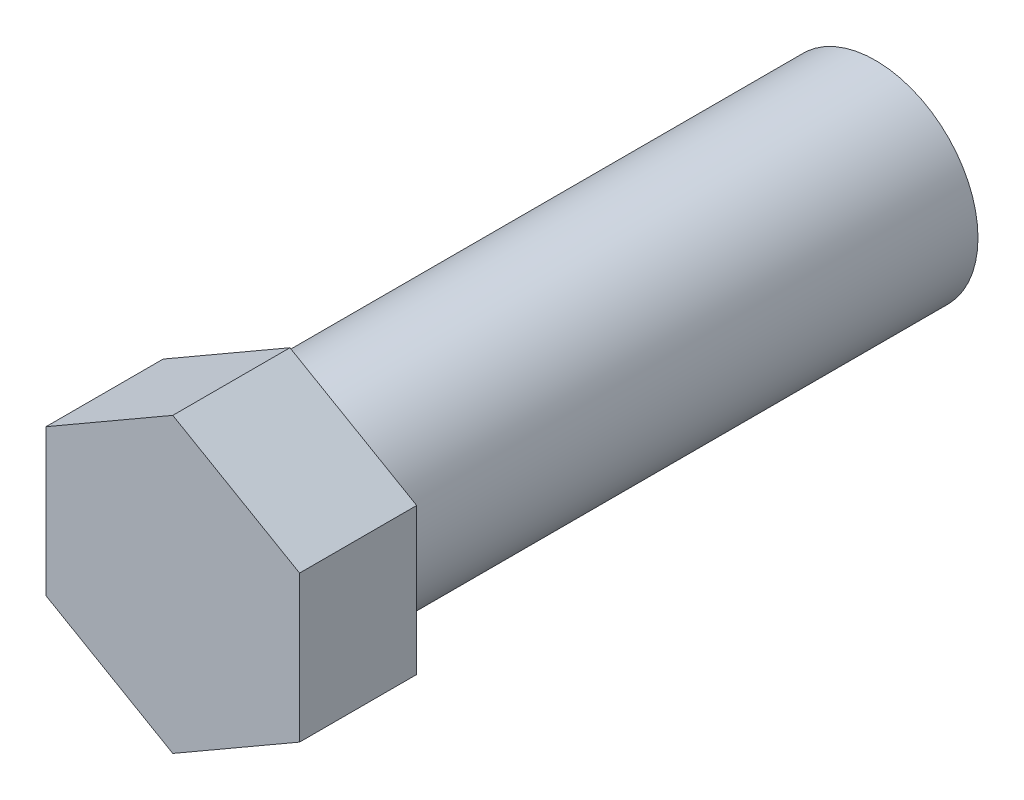
ISO-10303-21;
HEADER;
FILE_DESCRIPTION(('STEP AP214'),'2;1');
FILE_NAME('part.step','',(''),(''),'','','');
FILE_SCHEMA(('AUTOMOTIVE_DESIGN { 1 0 10303 214 1 1 1 1 }'));
ENDSEC;
DATA;
#1=APPLICATION_CONTEXT('core data for automotive mechanical design processes');
#2=APPLICATION_PROTOCOL_DEFINITION('international standard','automotive_design',2000,#1);
#3=PRODUCT_CONTEXT('',#1,'mechanical');
#4=PRODUCT('Part','Part','',(#3));
#5=PRODUCT_RELATED_PRODUCT_CATEGORY('part','',(#4));
#6=PRODUCT_DEFINITION_FORMATION('','',#4);
#7=PRODUCT_DEFINITION_CONTEXT('part definition',#1,'design');
#8=PRODUCT_DEFINITION('design','',#6,#7);
#9=PRODUCT_DEFINITION_SHAPE('','',#8);
#10=(LENGTH_UNIT() NAMED_UNIT(*) SI_UNIT(.MILLI.,.METRE.));
#11=(NAMED_UNIT(*) PLANE_ANGLE_UNIT() SI_UNIT($,.RADIAN.));
#12=(NAMED_UNIT(*) SI_UNIT($,.STERADIAN.) SOLID_ANGLE_UNIT());
#13=UNCERTAINTY_MEASURE_WITH_UNIT(LENGTH_MEASURE(1.E-05),#10,'distance_accuracy_value','');
#14=(GEOMETRIC_REPRESENTATION_CONTEXT(3) GLOBAL_UNCERTAINTY_ASSIGNED_CONTEXT((#13)) GLOBAL_UNIT_ASSIGNED_CONTEXT((#10,
#11,#12)) REPRESENTATION_CONTEXT('',''));
#15=CARTESIAN_POINT('',(0.,0.,0.));
#16=DIRECTION('',(0.,0.,1.));
#17=DIRECTION('',(1.,0.,0.));
#18=AXIS2_PLACEMENT_3D('',#15,#16,#17);
#19=CARTESIAN_POINT('',(0.,0.,10.));
#20=DIRECTION('',(0.,0.,-1.));
#21=DIRECTION('',(-1.,0.,0.));
#22=AXIS2_PLACEMENT_3D('',#19,#20,#21);
#23=CYLINDRICAL_SURFACE('',#22,1.75);
#24=CARTESIAN_POINT('',(0.,0.,10.));
#25=DIRECTION('',(0.,0.,1.));
#26=DIRECTION('',(1.,0.,0.));
#27=AXIS2_PLACEMENT_3D('',#24,#25,#26);
#28=CIRCLE('',#27,1.75);
#29=CARTESIAN_POINT('',(1.75,0.,10.));
#30=VERTEX_POINT('',#29);
#31=EDGE_CURVE('E11',#30,#30,#28,.T.);
#32=ORIENTED_EDGE('',*,*,#31,.F.);
#33=EDGE_LOOP('',(#32));
#34=FACE_BOUND('',#33,.T.);
#35=CARTESIAN_POINT('',(0.,0.,0.));
#36=DIRECTION('',(0.,0.,1.));
#37=DIRECTION('',(1.,0.,0.));
#38=AXIS2_PLACEMENT_3D('',#35,#36,#37);
#39=CIRCLE('',#38,1.75);
#40=CARTESIAN_POINT('',(1.75,0.,0.));
#41=VERTEX_POINT('',#40);
#42=EDGE_CURVE('E48',#41,#41,#39,.T.);
#43=ORIENTED_EDGE('',*,*,#42,.T.);
#44=EDGE_LOOP('',(#43));
#45=FACE_BOUND('',#44,.T.);
#46=ADVANCED_FACE('F45',(#34,#45),#23,.T.);
#47=CARTESIAN_POINT('',(0.,0.,0.));
#48=DIRECTION('',(0.,0.,1.));
#49=DIRECTION('',(1.,0.,0.));
#50=AXIS2_PLACEMENT_3D('',#47,#48,#49);
#51=PLANE('',#50);
#52=ORIENTED_EDGE('',*,*,#42,.F.);
#53=EDGE_LOOP('',(#52));
#54=FACE_BOUND('',#53,.T.);
#55=ADVANCED_FACE('F170',(#54),#51,.F.);
#56=CARTESIAN_POINT('',(1.08253175473054,1.87500000000001,12.));
#57=DIRECTION('',(-0.499999999999995,-0.866025403784441,0.));
#58=DIRECTION('',(0.866025403784442,-0.499999999999995,0.));
#59=AXIS2_PLACEMENT_3D('',#56,#57,#58);
#60=PLANE('',#59);
#61=DIRECTION('',(-0.866025403784442,0.499999999999995,0.));
#62=VECTOR('',#61,1.);
#63=CARTESIAN_POINT('',(1.08253175473054,1.87500000000001,10.));
#64=LINE('',#63,#62);
#65=CARTESIAN_POINT('',(2.16506350946108,1.25000000000002,10.));
#66=VERTEX_POINT('',#65);
#67=CARTESIAN_POINT('',(0.,2.5,10.));
#68=VERTEX_POINT('',#67);
#69=EDGE_CURVE('E135',#66,#68,#64,.T.);
#70=ORIENTED_EDGE('',*,*,#69,.T.);
#71=DIRECTION('',(0.,0.,-1.));
#72=VECTOR('',#71,1.);
#73=CARTESIAN_POINT('',(0.,2.5,12.));
#74=LINE('',#73,#72);
#75=CARTESIAN_POINT('',(0.,2.5,12.));
#76=VERTEX_POINT('',#75);
#77=EDGE_CURVE('E162',#76,#68,#74,.T.);
#78=ORIENTED_EDGE('',*,*,#77,.F.);
#79=DIRECTION('',(-0.866025403784442,0.499999999999995,0.));
#80=VECTOR('',#79,1.);
#81=CARTESIAN_POINT('',(1.08253175473054,1.87500000000001,12.));
#82=LINE('',#81,#80);
#83=CARTESIAN_POINT('',(2.16506350946108,1.25000000000002,12.));
#84=VERTEX_POINT('',#83);
#85=EDGE_CURVE('E151',#84,#76,#82,.T.);
#86=ORIENTED_EDGE('',*,*,#85,.F.);
#87=DIRECTION('',(0.,0.,-1.));
#88=VECTOR('',#87,1.);
#89=CARTESIAN_POINT('',(2.16506350946108,1.25000000000002,12.));
#90=LINE('',#89,#88);
#91=EDGE_CURVE('E131',#84,#66,#90,.T.);
#92=ORIENTED_EDGE('',*,*,#91,.T.);
#93=EDGE_LOOP('',(#70,#78,#86,#92));
#94=FACE_BOUND('',#93,.T.);
#95=ADVANCED_FACE('F172',(#94),#60,.F.);
#96=CARTESIAN_POINT('',(-1.08253175473055,1.875,12.));
#97=DIRECTION('',(0.500000000000001,-0.866025403784438,0.));
#98=DIRECTION('',(0.866025403784438,0.500000000000001,0.));
#99=AXIS2_PLACEMENT_3D('',#96,#97,#98);
#100=PLANE('',#99);
#101=DIRECTION('',(-0.866025403784438,-0.500000000000001,0.));
#102=VECTOR('',#101,1.);
#103=CARTESIAN_POINT('',(-1.08253175473055,1.875,10.));
#104=LINE('',#103,#102);
#105=CARTESIAN_POINT('',(-2.1650635094611,1.25,10.));
#106=VERTEX_POINT('',#105);
#107=EDGE_CURVE('E139',#68,#106,#104,.T.);
#108=ORIENTED_EDGE('',*,*,#107,.T.);
#109=DIRECTION('',(0.,0.,-1.));
#110=VECTOR('',#109,1.);
#111=CARTESIAN_POINT('',(-2.1650635094611,1.25,12.));
#112=LINE('',#111,#110);
#113=CARTESIAN_POINT('',(-2.1650635094611,1.25,12.));
#114=VERTEX_POINT('',#113);
#115=EDGE_CURVE('E158',#114,#106,#112,.T.);
#116=ORIENTED_EDGE('',*,*,#115,.F.);
#117=DIRECTION('',(-0.866025403784438,-0.500000000000001,0.));
#118=VECTOR('',#117,1.);
#119=CARTESIAN_POINT('',(-1.08253175473055,1.875,12.));
#120=LINE('',#119,#118);
#121=EDGE_CURVE('E100',#76,#114,#120,.T.);
#122=ORIENTED_EDGE('',*,*,#121,.F.);
#123=ORIENTED_EDGE('',*,*,#77,.T.);
#124=EDGE_LOOP('',(#108,#116,#122,#123));
#125=FACE_BOUND('',#124,.T.);
#126=ADVANCED_FACE('F177',(#125),#100,.F.);
#127=CARTESIAN_POINT('',(-2.1650635094611,0.,12.));
#128=DIRECTION('',(1.,0.,0.));
#129=DIRECTION('',(0.,1.,0.));
#130=AXIS2_PLACEMENT_3D('',#127,#128,#129);
#131=PLANE('',#130);
#132=DIRECTION('',(0.,-1.,0.));
#133=VECTOR('',#132,1.);
#134=CARTESIAN_POINT('',(-2.1650635094611,0.,10.));
#135=LINE('',#134,#133);
#136=CARTESIAN_POINT('',(-2.16506350946109,-1.25000000000001,10.));
#137=VERTEX_POINT('',#136);
#138=EDGE_CURVE('E142',#106,#137,#135,.T.);
#139=ORIENTED_EDGE('',*,*,#138,.T.);
#140=DIRECTION('',(0.,0.,-1.));
#141=VECTOR('',#140,1.);
#142=CARTESIAN_POINT('',(-2.16506350946109,-1.25000000000001,12.));
#143=LINE('',#142,#141);
#144=CARTESIAN_POINT('',(-2.16506350946109,-1.25000000000001,12.));
#145=VERTEX_POINT('',#144);
#146=EDGE_CURVE('E124',#145,#137,#143,.T.);
#147=ORIENTED_EDGE('',*,*,#146,.F.);
#148=DIRECTION('',(0.,-1.,0.));
#149=VECTOR('',#148,1.);
#150=CARTESIAN_POINT('',(-2.1650635094611,0.,12.));
#151=LINE('',#150,#149);
#152=EDGE_CURVE('E113',#114,#145,#151,.T.);
#153=ORIENTED_EDGE('',*,*,#152,.F.);
#154=ORIENTED_EDGE('',*,*,#115,.T.);
#155=EDGE_LOOP('',(#139,#147,#153,#154));
#156=FACE_BOUND('',#155,.T.);
#157=ADVANCED_FACE('F184',(#156),#131,.F.);
#158=CARTESIAN_POINT('',(-1.08253175473054,-1.875,12.));
#159=DIRECTION('',(0.499999999999995,0.866025403784442,0.));
#160=DIRECTION('',(-0.866025403784442,0.499999999999995,0.));
#161=AXIS2_PLACEMENT_3D('',#158,#159,#160);
#162=PLANE('',#161);
#163=DIRECTION('',(0.866025403784442,-0.499999999999995,0.));
#164=VECTOR('',#163,1.);
#165=CARTESIAN_POINT('',(-1.08253175473054,-1.875,10.));
#166=LINE('',#165,#164);
#167=CARTESIAN_POINT('',(0.,-2.5,10.));
#168=VERTEX_POINT('',#167);
#169=EDGE_CURVE('E122',#137,#168,#166,.T.);
#170=ORIENTED_EDGE('',*,*,#169,.T.);
#171=DIRECTION('',(0.,0.,-1.));
#172=VECTOR('',#171,1.);
#173=CARTESIAN_POINT('',(0.,-2.5,12.));
#174=LINE('',#173,#172);
#175=CARTESIAN_POINT('',(0.,-2.5,12.));
#176=VERTEX_POINT('',#175);
#177=EDGE_CURVE('E119',#176,#168,#174,.T.);
#178=ORIENTED_EDGE('',*,*,#177,.F.);
#179=DIRECTION('',(0.866025403784442,-0.499999999999995,0.));
#180=VECTOR('',#179,1.);
#181=CARTESIAN_POINT('',(-1.08253175473054,-1.875,12.));
#182=LINE('',#181,#180);
#183=EDGE_CURVE('E107',#145,#176,#182,.T.);
#184=ORIENTED_EDGE('',*,*,#183,.F.);
#185=ORIENTED_EDGE('',*,*,#146,.T.);
#186=EDGE_LOOP('',(#170,#178,#184,#185));
#187=FACE_BOUND('',#186,.T.);
#188=ADVANCED_FACE('F120',(#187),#162,.F.);
#189=CARTESIAN_POINT('',(1.08253175473056,-1.87499999999999,12.));
#190=DIRECTION('',(-0.500000000000007,0.866025403784435,0.));
#191=DIRECTION('',(-0.866025403784435,-0.500000000000007,0.));
#192=AXIS2_PLACEMENT_3D('',#189,#190,#191);
#193=PLANE('',#192);
#194=DIRECTION('',(0.866025403784435,0.500000000000007,0.));
#195=VECTOR('',#194,1.);
#196=CARTESIAN_POINT('',(1.08253175473056,-1.87499999999999,10.));
#197=LINE('',#196,#195);
#198=CARTESIAN_POINT('',(2.16506350946111,-1.24999999999998,10.));
#199=VERTEX_POINT('',#198);
#200=EDGE_CURVE('E85',#168,#199,#197,.T.);
#201=ORIENTED_EDGE('',*,*,#200,.T.);
#202=DIRECTION('',(0.,0.,-1.));
#203=VECTOR('',#202,1.);
#204=CARTESIAN_POINT('',(2.16506350946111,-1.24999999999998,12.));
#205=LINE('',#204,#203);
#206=CARTESIAN_POINT('',(2.16506350946111,-1.24999999999998,12.));
#207=VERTEX_POINT('',#206);
#208=EDGE_CURVE('E125',#207,#199,#205,.T.);
#209=ORIENTED_EDGE('',*,*,#208,.F.);
#210=DIRECTION('',(0.866025403784435,0.500000000000007,0.));
#211=VECTOR('',#210,1.);
#212=CARTESIAN_POINT('',(1.08253175473056,-1.87499999999999,12.));
#213=LINE('',#212,#211);
#214=EDGE_CURVE('E111',#176,#207,#213,.T.);
#215=ORIENTED_EDGE('',*,*,#214,.F.);
#216=ORIENTED_EDGE('',*,*,#177,.T.);
#217=EDGE_LOOP('',(#201,#209,#215,#216));
#218=FACE_BOUND('',#217,.T.);
#219=ADVANCED_FACE('F127',(#218),#193,.F.);
#220=CARTESIAN_POINT('',(2.1650635094611,0.,12.));
#221=DIRECTION('',(-1.,0.,0.));
#222=DIRECTION('',(0.,-1.,0.));
#223=AXIS2_PLACEMENT_3D('',#220,#221,#222);
#224=PLANE('',#223);
#225=DIRECTION('',(0.,1.,0.));
#226=VECTOR('',#225,1.);
#227=CARTESIAN_POINT('',(2.1650635094611,0.,10.));
#228=LINE('',#227,#226);
#229=EDGE_CURVE('E91',#199,#66,#228,.T.);
#230=ORIENTED_EDGE('',*,*,#229,.T.);
#231=ORIENTED_EDGE('',*,*,#91,.F.);
#232=DIRECTION('',(0.,1.,0.));
#233=VECTOR('',#232,1.);
#234=CARTESIAN_POINT('',(2.1650635094611,0.,12.));
#235=LINE('',#234,#233);
#236=EDGE_CURVE('E62',#207,#84,#235,.T.);
#237=ORIENTED_EDGE('',*,*,#236,.F.);
#238=ORIENTED_EDGE('',*,*,#208,.T.);
#239=EDGE_LOOP('',(#230,#231,#237,#238));
#240=FACE_BOUND('',#239,.T.);
#241=ADVANCED_FACE('F192',(#240),#224,.F.);
#242=CARTESIAN_POINT('',(0.,0.,12.));
#243=DIRECTION('',(0.,0.,1.));
#244=DIRECTION('',(1.,0.,0.));
#245=AXIS2_PLACEMENT_3D('',#242,#243,#244);
#246=PLANE('',#245);
#247=ORIENTED_EDGE('',*,*,#85,.T.);
#248=ORIENTED_EDGE('',*,*,#121,.T.);
#249=ORIENTED_EDGE('',*,*,#152,.T.);
#250=ORIENTED_EDGE('',*,*,#183,.T.);
#251=ORIENTED_EDGE('',*,*,#214,.T.);
#252=ORIENTED_EDGE('',*,*,#236,.T.);
#253=EDGE_LOOP('',(#247,#248,#249,#250,#251,#252));
#254=FACE_BOUND('',#253,.T.);
#255=ADVANCED_FACE('F109',(#254),#246,.T.);
#256=CARTESIAN_POINT('',(0.,0.,10.));
#257=DIRECTION('',(0.,0.,1.));
#258=DIRECTION('',(1.,0.,0.));
#259=AXIS2_PLACEMENT_3D('',#256,#257,#258);
#260=PLANE('',#259);
#261=ORIENTED_EDGE('',*,*,#31,.T.);
#262=EDGE_LOOP('',(#261));
#263=FACE_BOUND('',#262,.T.);
#264=ORIENTED_EDGE('',*,*,#69,.F.);
#265=ORIENTED_EDGE('',*,*,#229,.F.);
#266=ORIENTED_EDGE('',*,*,#200,.F.);
#267=ORIENTED_EDGE('',*,*,#169,.F.);
#268=ORIENTED_EDGE('',*,*,#138,.F.);
#269=ORIENTED_EDGE('',*,*,#107,.F.);
#270=EDGE_LOOP('',(#264,#265,#266,#267,#268,#269));
#271=FACE_BOUND('',#270,.T.);
#272=ADVANCED_FACE('F195',(#263,#271),#260,.F.);
#273=CLOSED_SHELL('',(#46,#55,#95,#126,#157,#188,#219,#241,#255,#272));
#274=MANIFOLD_SOLID_BREP('B2',#273);
#275=ADVANCED_BREP_SHAPE_REPRESENTATION('',(#18,#274),#14);
#276=SHAPE_DEFINITION_REPRESENTATION(#9,#275);
ENDSEC;
END-ISO-10303-21;
